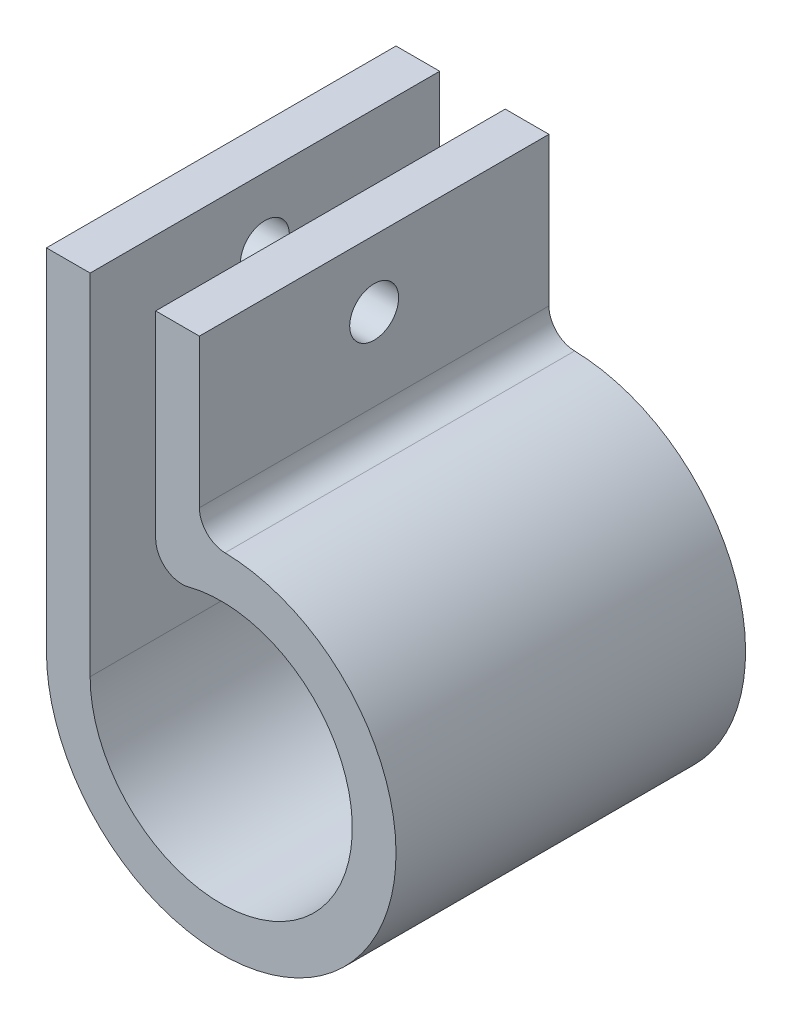
ISO-10303-21;
HEADER;
FILE_DESCRIPTION(('STEP AP214'),'2;1');
FILE_NAME('part.step','',(''),(''),'','','');
FILE_SCHEMA(('AUTOMOTIVE_DESIGN { 1 0 10303 214 1 1 1 1 }'));
ENDSEC;
DATA;
#1=APPLICATION_CONTEXT('core data for automotive mechanical design processes');
#2=APPLICATION_PROTOCOL_DEFINITION('international standard','automotive_design',2000,#1);
#3=PRODUCT_CONTEXT('',#1,'mechanical');
#4=PRODUCT('Part','Part','',(#3));
#5=PRODUCT_RELATED_PRODUCT_CATEGORY('part','',(#4));
#6=PRODUCT_DEFINITION_FORMATION('','',#4);
#7=PRODUCT_DEFINITION_CONTEXT('part definition',#1,'design');
#8=PRODUCT_DEFINITION('design','',#6,#7);
#9=PRODUCT_DEFINITION_SHAPE('','',#8);
#10=(LENGTH_UNIT() NAMED_UNIT(*) SI_UNIT(.MILLI.,.METRE.));
#11=(NAMED_UNIT(*) PLANE_ANGLE_UNIT() SI_UNIT($,.RADIAN.));
#12=(NAMED_UNIT(*) SI_UNIT($,.STERADIAN.) SOLID_ANGLE_UNIT());
#13=UNCERTAINTY_MEASURE_WITH_UNIT(LENGTH_MEASURE(1.E-05),#10,'distance_accuracy_value','');
#14=(GEOMETRIC_REPRESENTATION_CONTEXT(3) GLOBAL_UNCERTAINTY_ASSIGNED_CONTEXT((#13)) GLOBAL_UNIT_ASSIGNED_CONTEXT((#10,
#11,#12)) REPRESENTATION_CONTEXT('',''));
#15=CARTESIAN_POINT('',(0.,0.,0.));
#16=DIRECTION('',(0.,0.,1.));
#17=DIRECTION('',(1.,0.,0.));
#18=AXIS2_PLACEMENT_3D('',#15,#16,#17);
#19=CARTESIAN_POINT('',(-19.05,50.8,25.4));
#20=DIRECTION('',(-1.,0.,0.));
#21=DIRECTION('',(0.,-1.,0.));
#22=AXIS2_PLACEMENT_3D('',#19,#20,#21);
#23=PLANE('',#22);
#24=CARTESIAN_POINT('',(-19.05,41.148,0.));
#25=DIRECTION('',(-1.,0.,0.));
#26=DIRECTION('',(0.,-1.,0.));
#27=AXIS2_PLACEMENT_3D('',#24,#25,#26);
#28=CIRCLE('',#27,3.556);
#29=CARTESIAN_POINT('',(-19.05,37.592,0.));
#30=VERTEX_POINT('',#29);
#31=EDGE_CURVE('E197',#30,#30,#28,.T.);
#32=ORIENTED_EDGE('',*,*,#31,.T.);
#33=EDGE_LOOP('',(#32));
#34=FACE_BOUND('',#33,.T.);
#35=DIRECTION('',(0.,1.,0.));
#36=VECTOR('',#35,1.);
#37=CARTESIAN_POINT('',(-19.05,50.8,-25.4));
#38=LINE('',#37,#36);
#39=CARTESIAN_POINT('',(-19.05,0.,-25.4));
#40=VERTEX_POINT('',#39);
#41=CARTESIAN_POINT('',(-19.05,50.8,-25.4));
#42=VERTEX_POINT('',#41);
#43=EDGE_CURVE('E136',#40,#42,#38,.T.);
#44=ORIENTED_EDGE('',*,*,#43,.T.);
#45=DIRECTION('',(0.,0.,-1.));
#46=VECTOR('',#45,1.);
#47=CARTESIAN_POINT('',(-19.05,50.8,25.4));
#48=LINE('',#47,#46);
#49=CARTESIAN_POINT('',(-19.05,50.8,25.4));
#50=VERTEX_POINT('',#49);
#51=EDGE_CURVE('E116',#50,#42,#48,.T.);
#52=ORIENTED_EDGE('',*,*,#51,.F.);
#53=DIRECTION('',(0.,1.,0.));
#54=VECTOR('',#53,1.);
#55=CARTESIAN_POINT('',(-19.05,50.8,25.4));
#56=LINE('',#55,#54);
#57=CARTESIAN_POINT('',(-19.05,0.,25.4));
#58=VERTEX_POINT('',#57);
#59=EDGE_CURVE('E123',#58,#50,#56,.T.);
#60=ORIENTED_EDGE('',*,*,#59,.F.);
#61=DIRECTION('',(0.,0.,-1.));
#62=VECTOR('',#61,1.);
#63=CARTESIAN_POINT('',(-19.05,0.,25.4));
#64=LINE('',#63,#62);
#65=EDGE_CURVE('E181',#58,#40,#64,.T.);
#66=ORIENTED_EDGE('',*,*,#65,.T.);
#67=EDGE_LOOP('',(#44,#52,#60,#66));
#68=FACE_BOUND('',#67,.T.);
#69=ADVANCED_FACE('F34',(#34,#68),#23,.F.);
#70=CARTESIAN_POINT('',(-19.05,50.8,25.4));
#71=DIRECTION('',(0.,-1.,0.));
#72=DIRECTION('',(1.,0.,0.));
#73=AXIS2_PLACEMENT_3D('',#70,#71,#72);
#74=PLANE('',#73);
#75=DIRECTION('',(-1.,0.,0.));
#76=VECTOR('',#75,1.);
#77=CARTESIAN_POINT('',(-19.05,50.8,-25.4));
#78=LINE('',#77,#76);
#79=CARTESIAN_POINT('',(-25.4,50.8,-25.4));
#80=VERTEX_POINT('',#79);
#81=EDGE_CURVE('E193',#42,#80,#78,.T.);
#82=ORIENTED_EDGE('',*,*,#81,.T.);
#83=DIRECTION('',(0.,0.,-1.));
#84=VECTOR('',#83,1.);
#85=CARTESIAN_POINT('',(-25.4,50.8,25.4));
#86=LINE('',#85,#84);
#87=CARTESIAN_POINT('',(-25.4,50.8,25.4));
#88=VERTEX_POINT('',#87);
#89=EDGE_CURVE('E119',#88,#80,#86,.T.);
#90=ORIENTED_EDGE('',*,*,#89,.F.);
#91=DIRECTION('',(-1.,0.,0.));
#92=VECTOR('',#91,1.);
#93=CARTESIAN_POINT('',(-19.05,50.8,25.4));
#94=LINE('',#93,#92);
#95=EDGE_CURVE('E112',#50,#88,#94,.T.);
#96=ORIENTED_EDGE('',*,*,#95,.F.);
#97=ORIENTED_EDGE('',*,*,#51,.T.);
#98=EDGE_LOOP('',(#82,#90,#96,#97));
#99=FACE_BOUND('',#98,.T.);
#100=ADVANCED_FACE('F114',(#99),#74,.F.);
#101=CARTESIAN_POINT('',(-25.4,50.8,25.4));
#102=DIRECTION('',(1.,0.,0.));
#103=DIRECTION('',(0.,1.,0.));
#104=AXIS2_PLACEMENT_3D('',#101,#102,#103);
#105=PLANE('',#104);
#106=CARTESIAN_POINT('',(-25.4,41.148,0.));
#107=DIRECTION('',(1.,0.,0.));
#108=DIRECTION('',(0.,1.,0.));
#109=AXIS2_PLACEMENT_3D('',#106,#107,#108);
#110=CIRCLE('',#109,3.556);
#111=CARTESIAN_POINT('',(-25.4,37.592,0.));
#112=VERTEX_POINT('',#111);
#113=EDGE_CURVE('E208',#112,#112,#110,.T.);
#114=ORIENTED_EDGE('',*,*,#113,.T.);
#115=EDGE_LOOP('',(#114));
#116=FACE_BOUND('',#115,.T.);
#117=DIRECTION('',(0.,-1.,0.));
#118=VECTOR('',#117,1.);
#119=CARTESIAN_POINT('',(-25.4,50.8,-25.4));
#120=LINE('',#119,#118);
#121=CARTESIAN_POINT('',(-25.4,0.,-25.4));
#122=VERTEX_POINT('',#121);
#123=EDGE_CURVE('E174',#80,#122,#120,.T.);
#124=ORIENTED_EDGE('',*,*,#123,.T.);
#125=DIRECTION('',(0.,0.,-1.));
#126=VECTOR('',#125,1.);
#127=CARTESIAN_POINT('',(-25.4,0.,25.4));
#128=LINE('',#127,#126);
#129=CARTESIAN_POINT('',(-25.4,0.,25.4));
#130=VERTEX_POINT('',#129);
#131=EDGE_CURVE('E142',#130,#122,#128,.T.);
#132=ORIENTED_EDGE('',*,*,#131,.F.);
#133=DIRECTION('',(0.,-1.,0.));
#134=VECTOR('',#133,1.);
#135=CARTESIAN_POINT('',(-25.4,50.8,25.4));
#136=LINE('',#135,#134);
#137=EDGE_CURVE('E122',#88,#130,#136,.T.);
#138=ORIENTED_EDGE('',*,*,#137,.F.);
#139=ORIENTED_EDGE('',*,*,#89,.T.);
#140=EDGE_LOOP('',(#124,#132,#138,#139));
#141=FACE_BOUND('',#140,.T.);
#142=ADVANCED_FACE('F239',(#116,#141),#105,.F.);
#143=CARTESIAN_POINT('',(0.,0.,25.4));
#144=DIRECTION('',(0.,0.,-1.));
#145=DIRECTION('',(-1.,0.,0.));
#146=AXIS2_PLACEMENT_3D('',#143,#144,#145);
#147=CYLINDRICAL_SURFACE('',#146,25.4);
#148=CARTESIAN_POINT('',(0.,0.,-25.4));
#149=DIRECTION('',(0.,0.,1.));
#150=DIRECTION('',(1.,0.,0.));
#151=AXIS2_PLACEMENT_3D('',#148,#149,#150);
#152=CIRCLE('',#151,25.4);
#153=CARTESIAN_POINT('',(0.552173913043474,25.3939974003652,-25.4));
#154=VERTEX_POINT('',#153);
#155=EDGE_CURVE('E170',#122,#154,#152,.T.);
#156=ORIENTED_EDGE('',*,*,#155,.T.);
#157=DIRECTION('',(0.,0.,-1.));
#158=VECTOR('',#157,1.);
#159=CARTESIAN_POINT('',(0.552173913043474,25.3939974003652,25.4));
#160=LINE('',#159,#158);
#161=CARTESIAN_POINT('',(0.552173913043474,25.3939974003652,25.4));
#162=VERTEX_POINT('',#161);
#163=EDGE_CURVE('E50',#154,#162,#160,.F.);
#164=ORIENTED_EDGE('',*,*,#163,.T.);
#165=CARTESIAN_POINT('',(0.,0.,25.4));
#166=DIRECTION('',(0.,0.,1.));
#167=DIRECTION('',(1.,0.,0.));
#168=AXIS2_PLACEMENT_3D('',#165,#166,#167);
#169=CIRCLE('',#168,25.4);
#170=EDGE_CURVE('E190',#130,#162,#169,.T.);
#171=ORIENTED_EDGE('',*,*,#170,.F.);
#172=ORIENTED_EDGE('',*,*,#131,.T.);
#173=EDGE_LOOP('',(#156,#164,#171,#172));
#174=FACE_BOUND('',#173,.T.);
#175=ADVANCED_FACE('F189',(#174),#147,.T.);
#176=CARTESIAN_POINT('',(-3.17500000000001,50.8,25.4));
#177=DIRECTION('',(-1.,0.,0.));
#178=DIRECTION('',(0.,-1.,0.));
#179=AXIS2_PLACEMENT_3D('',#176,#177,#178);
#180=PLANE('',#179);
#181=CARTESIAN_POINT('',(-3.175,41.148,0.));
#182=DIRECTION('',(-1.,0.,0.));
#183=DIRECTION('',(0.,-1.,0.));
#184=AXIS2_PLACEMENT_3D('',#181,#182,#183);
#185=CIRCLE('',#184,3.556);
#186=CARTESIAN_POINT('',(-3.175,37.592,0.));
#187=VERTEX_POINT('',#186);
#188=EDGE_CURVE('E211',#187,#187,#185,.T.);
#189=ORIENTED_EDGE('',*,*,#188,.T.);
#190=EDGE_LOOP('',(#189));
#191=FACE_BOUND('',#190,.T.);
#192=DIRECTION('',(0.,1.,0.));
#193=VECTOR('',#192,1.);
#194=CARTESIAN_POINT('',(-3.17500000000001,50.8,25.4));
#195=LINE('',#194,#193);
#196=CARTESIAN_POINT('',(-3.175,29.20309701042,25.4));
#197=VERTEX_POINT('',#196);
#198=CARTESIAN_POINT('',(-3.17500000000001,50.8,25.4));
#199=VERTEX_POINT('',#198);
#200=EDGE_CURVE('E162',#197,#199,#195,.T.);
#201=ORIENTED_EDGE('',*,*,#200,.F.);
#202=DIRECTION('',(0.,0.,1.));
#203=VECTOR('',#202,1.);
#204=CARTESIAN_POINT('',(-3.175,29.20309701042,-25.4));
#205=LINE('',#204,#203);
#206=CARTESIAN_POINT('',(-3.175,29.20309701042,-25.4));
#207=VERTEX_POINT('',#206);
#208=EDGE_CURVE('E151',#197,#207,#205,.F.);
#209=ORIENTED_EDGE('',*,*,#208,.T.);
#210=DIRECTION('',(0.,1.,0.));
#211=VECTOR('',#210,1.);
#212=CARTESIAN_POINT('',(-3.17500000000001,50.8,-25.4));
#213=LINE('',#212,#211);
#214=CARTESIAN_POINT('',(-3.17500000000001,50.8,-25.4));
#215=VERTEX_POINT('',#214);
#216=EDGE_CURVE('E160',#207,#215,#213,.T.);
#217=ORIENTED_EDGE('',*,*,#216,.T.);
#218=DIRECTION('',(0.,0.,-1.));
#219=VECTOR('',#218,1.);
#220=CARTESIAN_POINT('',(-3.17500000000001,50.8,25.4));
#221=LINE('',#220,#219);
#222=EDGE_CURVE('E186',#199,#215,#221,.T.);
#223=ORIENTED_EDGE('',*,*,#222,.F.);
#224=EDGE_LOOP('',(#201,#209,#217,#223));
#225=FACE_BOUND('',#224,.T.);
#226=ADVANCED_FACE('F158',(#191,#225),#180,.F.);
#227=CARTESIAN_POINT('',(-9.525,50.8,25.4));
#228=DIRECTION('',(0.,-1.,0.));
#229=DIRECTION('',(0.,0.,-1.));
#230=AXIS2_PLACEMENT_3D('',#227,#228,#229);
#231=PLANE('',#230);
#232=DIRECTION('',(-1.,0.,0.));
#233=VECTOR('',#232,1.);
#234=CARTESIAN_POINT('',(-9.525,50.8,-25.4));
#235=LINE('',#234,#233);
#236=CARTESIAN_POINT('',(-9.525,50.8,-25.4));
#237=VERTEX_POINT('',#236);
#238=EDGE_CURVE('E169',#215,#237,#235,.T.);
#239=ORIENTED_EDGE('',*,*,#238,.T.);
#240=DIRECTION('',(0.,0.,-1.));
#241=VECTOR('',#240,1.);
#242=CARTESIAN_POINT('',(-9.525,50.8,25.4));
#243=LINE('',#242,#241);
#244=CARTESIAN_POINT('',(-9.525,50.8,25.4));
#245=VERTEX_POINT('',#244);
#246=EDGE_CURVE('E183',#245,#237,#243,.T.);
#247=ORIENTED_EDGE('',*,*,#246,.F.);
#248=DIRECTION('',(-1.,0.,0.));
#249=VECTOR('',#248,1.);
#250=CARTESIAN_POINT('',(-9.525,50.8,25.4));
#251=LINE('',#250,#249);
#252=EDGE_CURVE('E201',#199,#245,#251,.T.);
#253=ORIENTED_EDGE('',*,*,#252,.F.);
#254=ORIENTED_EDGE('',*,*,#222,.T.);
#255=EDGE_LOOP('',(#239,#247,#253,#254));
#256=FACE_BOUND('',#255,.T.);
#257=ADVANCED_FACE('F257',(#256),#231,.F.);
#258=CARTESIAN_POINT('',(-9.525,16.4977839420936,25.4));
#259=DIRECTION('',(1.,0.,0.));
#260=DIRECTION('',(0.,0.,-1.));
#261=AXIS2_PLACEMENT_3D('',#258,#259,#260);
#262=PLANE('',#261);
#263=CARTESIAN_POINT('',(-9.525,41.148,0.));
#264=DIRECTION('',(1.,0.,0.));
#265=DIRECTION('',(0.,0.,-1.));
#266=AXIS2_PLACEMENT_3D('',#263,#264,#265);
#267=CIRCLE('',#266,3.556);
#268=CARTESIAN_POINT('',(-9.52500000000001,37.592,0.));
#269=VERTEX_POINT('',#268);
#270=EDGE_CURVE('E38',#269,#269,#267,.T.);
#271=ORIENTED_EDGE('',*,*,#270,.T.);
#272=EDGE_LOOP('',(#271));
#273=FACE_BOUND('',#272,.T.);
#274=DIRECTION('',(0.,-1.,0.));
#275=VECTOR('',#274,1.);
#276=CARTESIAN_POINT('',(-9.525,16.4977839420936,-25.4));
#277=LINE('',#276,#275);
#278=CARTESIAN_POINT('',(-9.525,22.1340998235754,-25.4));
#279=VERTEX_POINT('',#278);
#280=EDGE_CURVE('E172',#237,#279,#277,.T.);
#281=ORIENTED_EDGE('',*,*,#280,.T.);
#282=DIRECTION('',(0.,0.,-1.));
#283=VECTOR('',#282,1.);
#284=CARTESIAN_POINT('',(-9.525,22.1340998235754,25.4));
#285=LINE('',#284,#283);
#286=CARTESIAN_POINT('',(-9.525,22.1340998235754,25.4));
#287=VERTEX_POINT('',#286);
#288=EDGE_CURVE('E147',#279,#287,#285,.F.);
#289=ORIENTED_EDGE('',*,*,#288,.T.);
#290=DIRECTION('',(0.,-1.,0.));
#291=VECTOR('',#290,1.);
#292=CARTESIAN_POINT('',(-9.525,16.4977839420936,25.4));
#293=LINE('',#292,#291);
#294=EDGE_CURVE('E199',#245,#287,#293,.T.);
#295=ORIENTED_EDGE('',*,*,#294,.F.);
#296=ORIENTED_EDGE('',*,*,#246,.T.);
#297=EDGE_LOOP('',(#281,#289,#295,#296));
#298=FACE_BOUND('',#297,.T.);
#299=ADVANCED_FACE('F218',(#273,#298),#262,.F.);
#300=CARTESIAN_POINT('',(0.,0.,25.4));
#301=DIRECTION('',(0.,0.,-1.));
#302=DIRECTION('',(-1.,0.,0.));
#303=AXIS2_PLACEMENT_3D('',#300,#301,#302);
#304=CYLINDRICAL_SURFACE('',#303,19.05);
#305=CARTESIAN_POINT('',(0.,0.,25.4));
#306=DIRECTION('',(0.,0.,-1.));
#307=DIRECTION('',(1.,0.,0.));
#308=AXIS2_PLACEMENT_3D('',#305,#306,#307);
#309=CIRCLE('',#308,19.05);
#310=CARTESIAN_POINT('',(-4.7625,18.4450831863128,25.4));
#311=VERTEX_POINT('',#310);
#312=EDGE_CURVE('E129',#311,#58,#309,.T.);
#313=ORIENTED_EDGE('',*,*,#312,.F.);
#314=DIRECTION('',(0.,0.,-1.));
#315=VECTOR('',#314,1.);
#316=CARTESIAN_POINT('',(-4.7625,18.4450831863128,25.4));
#317=LINE('',#316,#315);
#318=CARTESIAN_POINT('',(-4.7625,18.4450831863128,-25.4));
#319=VERTEX_POINT('',#318);
#320=EDGE_CURVE('E137',#311,#319,#317,.T.);
#321=ORIENTED_EDGE('',*,*,#320,.T.);
#322=CARTESIAN_POINT('',(0.,0.,-25.4));
#323=DIRECTION('',(0.,0.,-1.));
#324=DIRECTION('',(1.,0.,0.));
#325=AXIS2_PLACEMENT_3D('',#322,#323,#324);
#326=CIRCLE('',#325,19.05);
#327=EDGE_CURVE('E133',#319,#40,#326,.T.);
#328=ORIENTED_EDGE('',*,*,#327,.T.);
#329=ORIENTED_EDGE('',*,*,#65,.F.);
#330=EDGE_LOOP('',(#313,#321,#328,#329));
#331=FACE_BOUND('',#330,.T.);
#332=ADVANCED_FACE('F253',(#331),#304,.F.);
#333=CARTESIAN_POINT('',(0.,0.,25.4));
#334=DIRECTION('',(0.,0.,1.));
#335=DIRECTION('',(1.,0.,0.));
#336=AXIS2_PLACEMENT_3D('',#333,#334,#335);
#337=PLANE('',#336);
#338=ORIENTED_EDGE('',*,*,#294,.T.);
#339=CARTESIAN_POINT('',(-5.715,22.1340998235754,25.4));
#340=DIRECTION('',(0.,0.,1.));
#341=DIRECTION('',(1.,0.,0.));
#342=AXIS2_PLACEMENT_3D('',#339,#340,#341);
#343=CIRCLE('',#342,3.81);
#344=EDGE_CURVE('E149',#287,#311,#343,.T.);
#345=ORIENTED_EDGE('',*,*,#344,.T.);
#346=ORIENTED_EDGE('',*,*,#312,.T.);
#347=ORIENTED_EDGE('',*,*,#59,.T.);
#348=ORIENTED_EDGE('',*,*,#95,.T.);
#349=ORIENTED_EDGE('',*,*,#137,.T.);
#350=ORIENTED_EDGE('',*,*,#170,.T.);
#351=CARTESIAN_POINT('',(0.634999999999995,29.20309701042,25.4));
#352=DIRECTION('',(0.,0.,1.));
#353=DIRECTION('',(1.,0.,0.));
#354=AXIS2_PLACEMENT_3D('',#351,#352,#353);
#355=CIRCLE('',#354,3.81);
#356=EDGE_CURVE('E11',#162,#197,#355,.F.);
#357=ORIENTED_EDGE('',*,*,#356,.T.);
#358=ORIENTED_EDGE('',*,*,#200,.T.);
#359=ORIENTED_EDGE('',*,*,#252,.T.);
#360=EDGE_LOOP('',(#338,#345,#346,#347,#348,#349,#350,#357,#358,#359));
#361=FACE_BOUND('',#360,.T.);
#362=ADVANCED_FACE('F127',(#361),#337,.T.);
#363=CARTESIAN_POINT('',(0.,0.,-25.4));
#364=DIRECTION('',(0.,0.,1.));
#365=DIRECTION('',(1.,0.,0.));
#366=AXIS2_PLACEMENT_3D('',#363,#364,#365);
#367=PLANE('',#366);
#368=ORIENTED_EDGE('',*,*,#327,.F.);
#369=CARTESIAN_POINT('',(-5.715,22.1340998235754,-25.4));
#370=DIRECTION('',(0.,0.,1.));
#371=DIRECTION('',(1.,0.,0.));
#372=AXIS2_PLACEMENT_3D('',#369,#370,#371);
#373=CIRCLE('',#372,3.81);
#374=EDGE_CURVE('E140',#319,#279,#373,.F.);
#375=ORIENTED_EDGE('',*,*,#374,.T.);
#376=ORIENTED_EDGE('',*,*,#280,.F.);
#377=ORIENTED_EDGE('',*,*,#238,.F.);
#378=ORIENTED_EDGE('',*,*,#216,.F.);
#379=CARTESIAN_POINT('',(0.634999999999995,29.20309701042,-25.4));
#380=DIRECTION('',(0.,0.,1.));
#381=DIRECTION('',(1.,0.,0.));
#382=AXIS2_PLACEMENT_3D('',#379,#380,#381);
#383=CIRCLE('',#382,3.81);
#384=EDGE_CURVE('E43',#207,#154,#383,.T.);
#385=ORIENTED_EDGE('',*,*,#384,.T.);
#386=ORIENTED_EDGE('',*,*,#155,.F.);
#387=ORIENTED_EDGE('',*,*,#123,.F.);
#388=ORIENTED_EDGE('',*,*,#81,.F.);
#389=ORIENTED_EDGE('',*,*,#43,.F.);
#390=EDGE_LOOP('',(#368,#375,#376,#377,#378,#385,#386,#387,#388,#389));
#391=FACE_BOUND('',#390,.T.);
#392=ADVANCED_FACE('F167',(#391),#367,.F.);
#393=CARTESIAN_POINT('',(-5.715,22.1340998235754,25.4));
#394=DIRECTION('',(0.,0.,-1.));
#395=DIRECTION('',(-1.,0.,0.));
#396=AXIS2_PLACEMENT_3D('',#393,#394,#395);
#397=CYLINDRICAL_SURFACE('',#396,3.81);
#398=ORIENTED_EDGE('',*,*,#344,.F.);
#399=ORIENTED_EDGE('',*,*,#288,.F.);
#400=ORIENTED_EDGE('',*,*,#374,.F.);
#401=ORIENTED_EDGE('',*,*,#320,.F.);
#402=EDGE_LOOP('',(#398,#399,#400,#401));
#403=FACE_BOUND('',#402,.T.);
#404=ADVANCED_FACE('F231',(#403),#397,.T.);
#405=CARTESIAN_POINT('',(0.634999999999995,29.20309701042,25.4));
#406=DIRECTION('',(0.,0.,-1.));
#407=DIRECTION('',(-1.,0.,0.));
#408=AXIS2_PLACEMENT_3D('',#405,#406,#407);
#409=CYLINDRICAL_SURFACE('',#408,3.81);
#410=ORIENTED_EDGE('',*,*,#356,.F.);
#411=ORIENTED_EDGE('',*,*,#163,.F.);
#412=ORIENTED_EDGE('',*,*,#384,.F.);
#413=ORIENTED_EDGE('',*,*,#208,.F.);
#414=EDGE_LOOP('',(#410,#411,#412,#413));
#415=FACE_BOUND('',#414,.T.);
#416=ADVANCED_FACE('F36',(#415),#409,.F.);
#417=CARTESIAN_POINT('',(25.4,41.148,0.));
#418=DIRECTION('',(-1.,0.,0.));
#419=DIRECTION('',(0.,-1.,0.));
#420=AXIS2_PLACEMENT_3D('',#417,#418,#419);
#421=CYLINDRICAL_SURFACE('',#420,3.556);
#422=CARTESIAN_POINT('',(-9.52500000000001,37.592,0.));
#423=CARTESIAN_POINT('',(-9.45885416666667,37.592,0.));
#424=CARTESIAN_POINT('',(-9.39270833333334,37.592,0.));
#425=CARTESIAN_POINT('',(-9.26041666666667,37.592,0.));
#426=CARTESIAN_POINT('',(-9.19427083333334,37.592,0.));
#427=CARTESIAN_POINT('',(-9.06197916666667,37.592,0.));
#428=CARTESIAN_POINT('',(-8.99583333333334,37.592,0.));
#429=CARTESIAN_POINT('',(-8.86354166666667,37.592,0.));
#430=CARTESIAN_POINT('',(-8.79739583333334,37.592,0.));
#431=CARTESIAN_POINT('',(-8.66510416666667,37.592,0.));
#432=CARTESIAN_POINT('',(-8.59895833333334,37.592,0.));
#433=CARTESIAN_POINT('',(-8.46666666666667,37.592,0.));
#434=CARTESIAN_POINT('',(-8.40052083333334,37.592,0.));
#435=CARTESIAN_POINT('',(-8.26822916666667,37.592,0.));
#436=CARTESIAN_POINT('',(-8.20208333333334,37.592,0.));
#437=CARTESIAN_POINT('',(-8.06979166666667,37.592,0.));
#438=CARTESIAN_POINT('',(-8.00364583333334,37.592,0.));
#439=CARTESIAN_POINT('',(-7.87135416666667,37.592,0.));
#440=CARTESIAN_POINT('',(-7.80520833333334,37.592,0.));
#441=CARTESIAN_POINT('',(-7.67291666666667,37.592,0.));
#442=CARTESIAN_POINT('',(-7.60677083333334,37.592,0.));
#443=CARTESIAN_POINT('',(-7.47447916666667,37.592,0.));
#444=CARTESIAN_POINT('',(-7.40833333333333,37.592,0.));
#445=CARTESIAN_POINT('',(-7.27604166666667,37.592,0.));
#446=CARTESIAN_POINT('',(-7.20989583333334,37.592,0.));
#447=CARTESIAN_POINT('',(-7.07760416666667,37.592,0.));
#448=CARTESIAN_POINT('',(-7.01145833333334,37.592,0.));
#449=CARTESIAN_POINT('',(-6.87916666666667,37.592,0.));
#450=CARTESIAN_POINT('',(-6.81302083333333,37.592,0.));
#451=CARTESIAN_POINT('',(-6.68072916666667,37.592,0.));
#452=CARTESIAN_POINT('',(-6.61458333333334,37.592,0.));
#453=CARTESIAN_POINT('',(-6.48229166666667,37.592,0.));
#454=CARTESIAN_POINT('',(-6.41614583333333,37.592,0.));
#455=CARTESIAN_POINT('',(-6.28385416666667,37.592,0.));
#456=CARTESIAN_POINT('',(-6.21770833333333,37.592,0.));
#457=CARTESIAN_POINT('',(-6.08541666666667,37.592,0.));
#458=CARTESIAN_POINT('',(-6.01927083333334,37.592,0.));
#459=CARTESIAN_POINT('',(-5.88697916666667,37.592,0.));
#460=CARTESIAN_POINT('',(-5.82083333333334,37.592,0.));
#461=CARTESIAN_POINT('',(-5.68854166666667,37.592,0.));
#462=CARTESIAN_POINT('',(-5.62239583333334,37.592,0.));
#463=CARTESIAN_POINT('',(-5.49010416666667,37.592,0.));
#464=CARTESIAN_POINT('',(-5.42395833333334,37.592,0.));
#465=CARTESIAN_POINT('',(-5.29166666666667,37.592,0.));
#466=CARTESIAN_POINT('',(-5.22552083333334,37.592,0.));
#467=CARTESIAN_POINT('',(-5.09322916666667,37.592,0.));
#468=CARTESIAN_POINT('',(-5.02708333333334,37.592,0.));
#469=CARTESIAN_POINT('',(-4.89479166666667,37.592,0.));
#470=CARTESIAN_POINT('',(-4.82864583333334,37.592,0.));
#471=CARTESIAN_POINT('',(-4.69635416666667,37.592,0.));
#472=CARTESIAN_POINT('',(-4.63020833333334,37.592,0.));
#473=CARTESIAN_POINT('',(-4.49791666666667,37.592,0.));
#474=CARTESIAN_POINT('',(-4.43177083333333,37.592,0.));
#475=CARTESIAN_POINT('',(-4.29947916666667,37.592,0.));
#476=CARTESIAN_POINT('',(-4.23333333333334,37.592,0.));
#477=CARTESIAN_POINT('',(-4.10104166666667,37.592,0.));
#478=CARTESIAN_POINT('',(-4.03489583333334,37.592,0.));
#479=CARTESIAN_POINT('',(-3.90260416666667,37.592,0.));
#480=CARTESIAN_POINT('',(-3.83645833333334,37.592,0.));
#481=CARTESIAN_POINT('',(-3.70416666666667,37.592,0.));
#482=CARTESIAN_POINT('',(-3.63802083333334,37.592,0.));
#483=CARTESIAN_POINT('',(-3.50572916666667,37.592,0.));
#484=CARTESIAN_POINT('',(-3.43958333333334,37.592,0.));
#485=CARTESIAN_POINT('',(-3.30729166666667,37.592,0.));
#486=CARTESIAN_POINT('',(-3.24114583333333,37.592,0.));
#487=CARTESIAN_POINT('',(-3.175,37.592,0.));
#488=B_SPLINE_CURVE_WITH_KNOTS('',3,(#422,#423,#424,#425,#426,#427,#428,#429,#430,#431,#432,
#433,#434,#435,#436,#437,#438,#439,#440,#441,#442,#443,#444,#445,#446,#447,#448,#449,#450,#451,
#452,#453,#454,#455,#456,#457,#458,#459,#460,#461,#462,#463,#464,#465,#466,#467,#468,#469,#470,
#471,#472,#473,#474,#475,#476,#477,#478,#479,#480,#481,#482,#483,#484,#485,#486,#487),
.UNSPECIFIED.,.F.,.F.,(4,2,2,2,2,2,2,2,2,2,2,2,2,2,2,2,2,2,2,2,2,2,2,2,2,2,2,2,2,2,2,2,4),(0.,
0.198437500000002,0.396874999999998,0.5953125,0.793750000000003,0.992187499999998,1.190625,
1.3890625,1.58750000000001,1.7859375,1.984375,2.18281250000001,2.38125,2.5796875,
2.77812500000001,2.9765625,3.175,3.37343750000001,3.571875,3.7703125,3.96875,4.1671875,4.365625,
4.5640625,4.7625,4.9609375,5.159375,5.3578125,5.55625,5.7546875,5.953125,6.1515625,6.35),.UNSPECIFIED.);
#489=EDGE_CURVE('BSEAM221',#269,#187,#488,.T.);
#490=ORIENTED_EDGE('',*,*,#270,.F.);
#491=ORIENTED_EDGE('',*,*,#188,.F.);
#492=ORIENTED_EDGE('',*,*,#489,.T.);
#493=ORIENTED_EDGE('',*,*,#489,.F.);
#494=EDGE_LOOP('',(#490,#492,#491,#493));
#495=FACE_BOUND('',#494,.T.);
#496=ADVANCED_FACE('F221',(#495),#421,.F.);
#497=CARTESIAN_POINT('',(-25.4,37.592,0.));
#498=CARTESIAN_POINT('',(-25.3338541666667,37.592,0.));
#499=CARTESIAN_POINT('',(-25.2677083333333,37.592,0.));
#500=CARTESIAN_POINT('',(-25.1354166666667,37.592,0.));
#501=CARTESIAN_POINT('',(-25.0692708333333,37.592,0.));
#502=CARTESIAN_POINT('',(-24.9369791666667,37.592,0.));
#503=CARTESIAN_POINT('',(-24.8708333333333,37.592,0.));
#504=CARTESIAN_POINT('',(-24.7385416666667,37.592,0.));
#505=CARTESIAN_POINT('',(-24.6723958333333,37.592,0.));
#506=CARTESIAN_POINT('',(-24.5401041666667,37.592,0.));
#507=CARTESIAN_POINT('',(-24.4739583333333,37.592,0.));
#508=CARTESIAN_POINT('',(-24.3416666666667,37.592,0.));
#509=CARTESIAN_POINT('',(-24.2755208333333,37.592,0.));
#510=CARTESIAN_POINT('',(-24.1432291666667,37.592,0.));
#511=CARTESIAN_POINT('',(-24.0770833333333,37.592,0.));
#512=CARTESIAN_POINT('',(-23.9447916666667,37.592,0.));
#513=CARTESIAN_POINT('',(-23.8786458333333,37.592,0.));
#514=CARTESIAN_POINT('',(-23.7463541666667,37.592,0.));
#515=CARTESIAN_POINT('',(-23.6802083333333,37.592,0.));
#516=CARTESIAN_POINT('',(-23.5479166666667,37.592,0.));
#517=CARTESIAN_POINT('',(-23.4817708333333,37.592,0.));
#518=CARTESIAN_POINT('',(-23.3494791666667,37.592,0.));
#519=CARTESIAN_POINT('',(-23.2833333333333,37.592,0.));
#520=CARTESIAN_POINT('',(-23.1510416666667,37.592,0.));
#521=CARTESIAN_POINT('',(-23.0848958333333,37.592,0.));
#522=CARTESIAN_POINT('',(-22.9526041666667,37.592,0.));
#523=CARTESIAN_POINT('',(-22.8864583333333,37.592,0.));
#524=CARTESIAN_POINT('',(-22.7541666666667,37.592,0.));
#525=CARTESIAN_POINT('',(-22.6880208333333,37.592,0.));
#526=CARTESIAN_POINT('',(-22.5557291666667,37.592,0.));
#527=CARTESIAN_POINT('',(-22.4895833333333,37.592,0.));
#528=CARTESIAN_POINT('',(-22.3572916666667,37.592,0.));
#529=CARTESIAN_POINT('',(-22.2911458333333,37.592,0.));
#530=CARTESIAN_POINT('',(-22.1588541666667,37.592,0.));
#531=CARTESIAN_POINT('',(-22.0927083333333,37.592,0.));
#532=CARTESIAN_POINT('',(-21.9604166666667,37.592,0.));
#533=CARTESIAN_POINT('',(-21.8942708333333,37.592,0.));
#534=CARTESIAN_POINT('',(-21.7619791666667,37.592,0.));
#535=CARTESIAN_POINT('',(-21.6958333333333,37.592,0.));
#536=CARTESIAN_POINT('',(-21.5635416666667,37.592,0.));
#537=CARTESIAN_POINT('',(-21.4973958333333,37.592,0.));
#538=CARTESIAN_POINT('',(-21.3651041666667,37.592,0.));
#539=CARTESIAN_POINT('',(-21.2989583333333,37.592,0.));
#540=CARTESIAN_POINT('',(-21.1666666666667,37.592,0.));
#541=CARTESIAN_POINT('',(-21.1005208333333,37.592,0.));
#542=CARTESIAN_POINT('',(-20.9682291666667,37.592,0.));
#543=CARTESIAN_POINT('',(-20.9020833333333,37.592,0.));
#544=CARTESIAN_POINT('',(-20.7697916666667,37.592,0.));
#545=CARTESIAN_POINT('',(-20.7036458333333,37.592,0.));
#546=CARTESIAN_POINT('',(-20.5713541666667,37.592,0.));
#547=CARTESIAN_POINT('',(-20.5052083333333,37.592,0.));
#548=CARTESIAN_POINT('',(-20.3729166666667,37.592,0.));
#549=CARTESIAN_POINT('',(-20.3067708333333,37.592,0.));
#550=CARTESIAN_POINT('',(-20.1744791666667,37.592,0.));
#551=CARTESIAN_POINT('',(-20.1083333333333,37.592,0.));
#552=CARTESIAN_POINT('',(-19.9760416666667,37.592,0.));
#553=CARTESIAN_POINT('',(-19.9098958333333,37.592,0.));
#554=CARTESIAN_POINT('',(-19.7776041666667,37.592,0.));
#555=CARTESIAN_POINT('',(-19.7114583333333,37.592,0.));
#556=CARTESIAN_POINT('',(-19.5791666666667,37.592,0.));
#557=CARTESIAN_POINT('',(-19.5130208333333,37.592,0.));
#558=CARTESIAN_POINT('',(-19.3807291666667,37.592,0.));
#559=CARTESIAN_POINT('',(-19.3145833333333,37.592,0.));
#560=CARTESIAN_POINT('',(-19.1822916666667,37.592,0.));
#561=CARTESIAN_POINT('',(-19.1161458333333,37.592,0.));
#562=CARTESIAN_POINT('',(-19.05,37.592,0.));
#563=B_SPLINE_CURVE_WITH_KNOTS('',3,(#497,#498,#499,#500,#501,#502,#503,#504,#505,#506,#507,
#508,#509,#510,#511,#512,#513,#514,#515,#516,#517,#518,#519,#520,#521,#522,#523,#524,#525,#526,
#527,#528,#529,#530,#531,#532,#533,#534,#535,#536,#537,#538,#539,#540,#541,#542,#543,#544,#545,
#546,#547,#548,#549,#550,#551,#552,#553,#554,#555,#556,#557,#558,#559,#560,#561,#562),
.UNSPECIFIED.,.F.,.F.,(4,2,2,2,2,2,2,2,2,2,2,2,2,2,2,2,2,2,2,2,2,2,2,2,2,2,2,2,2,2,2,2,4),(0.,
0.198437500000002,0.396874999999998,0.5953125,0.793750000000003,0.992187499999998,1.190625,
1.3890625,1.58750000000001,1.7859375,1.984375,2.18281250000001,2.38125,2.5796875,
2.77812500000001,2.9765625,3.175,3.37343750000001,3.571875,3.7703125,3.96875000000001,4.1671875,
4.365625,4.56406250000001,4.7625,4.96093750000001,5.15937500000001,5.3578125,5.55625000000001,
5.75468750000001,5.95312500000001,6.15156250000001,6.35000000000001),.UNSPECIFIED.);
#564=EDGE_CURVE('BSEAM224',#112,#30,#563,.T.);
#565=ORIENTED_EDGE('',*,*,#113,.F.);
#566=ORIENTED_EDGE('',*,*,#31,.F.);
#567=ORIENTED_EDGE('',*,*,#564,.T.);
#568=ORIENTED_EDGE('',*,*,#564,.F.);
#569=EDGE_LOOP('',(#565,#567,#566,#568));
#570=FACE_BOUND('',#569,.T.);
#571=ADVANCED_FACE('F224',(#570),#421,.F.);
#572=CLOSED_SHELL('',(#69,#100,#142,#175,#226,#257,#299,#332,#362,#392,#404,#416,#496,#571));
#573=MANIFOLD_SOLID_BREP('B2',#572);
#574=ADVANCED_BREP_SHAPE_REPRESENTATION('',(#18,#573),#14);
#575=SHAPE_DEFINITION_REPRESENTATION(#9,#574);
ENDSEC;
END-ISO-10303-21;
